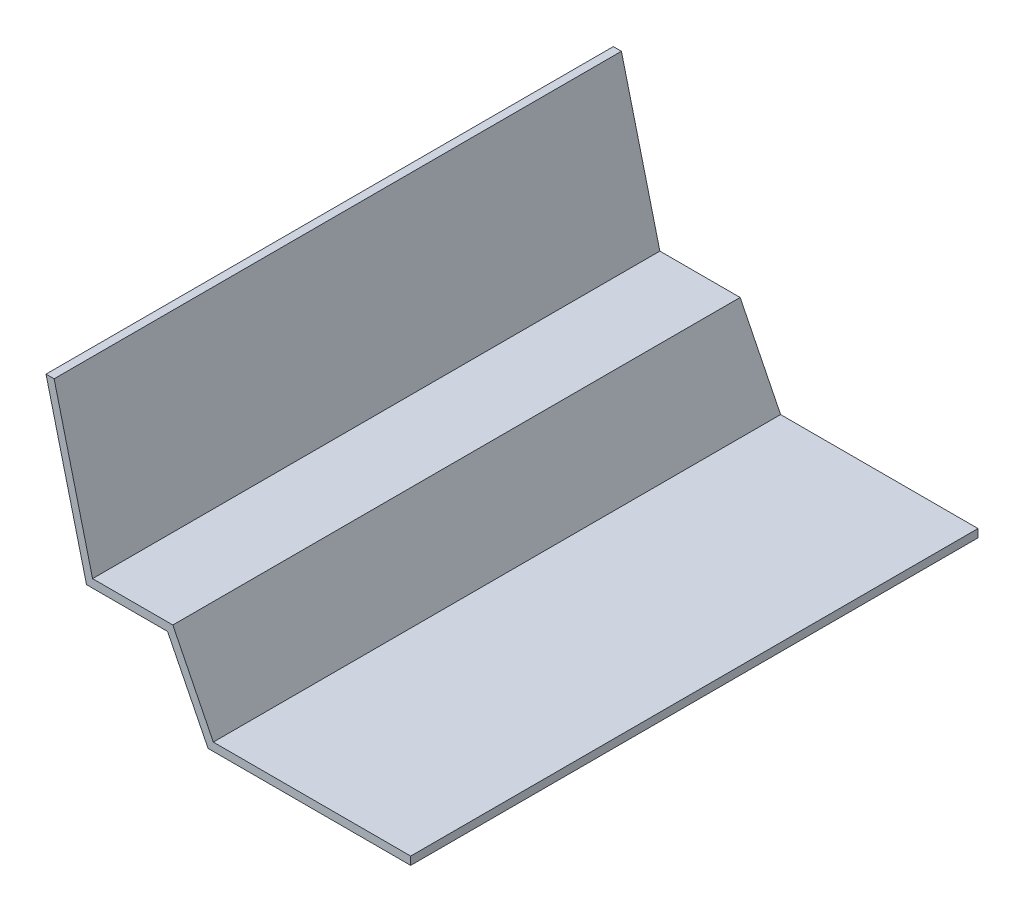
ISO-10303-21;
HEADER;
FILE_DESCRIPTION(('STEP AP214'),'2;1');
FILE_NAME('part.step','',(''),(''),'','','');
FILE_SCHEMA(('AUTOMOTIVE_DESIGN { 1 0 10303 214 1 1 1 1 }'));
ENDSEC;
DATA;
#1=APPLICATION_CONTEXT('core data for automotive mechanical design processes');
#2=APPLICATION_PROTOCOL_DEFINITION('international standard','automotive_design',2000,#1);
#3=PRODUCT_CONTEXT('',#1,'mechanical');
#4=PRODUCT('Part','Part','',(#3));
#5=PRODUCT_RELATED_PRODUCT_CATEGORY('part','',(#4));
#6=PRODUCT_DEFINITION_FORMATION('','',#4);
#7=PRODUCT_DEFINITION_CONTEXT('part definition',#1,'design');
#8=PRODUCT_DEFINITION('design','',#6,#7);
#9=PRODUCT_DEFINITION_SHAPE('','',#8);
#10=(LENGTH_UNIT() NAMED_UNIT(*) SI_UNIT(.MILLI.,.METRE.));
#11=(NAMED_UNIT(*) PLANE_ANGLE_UNIT() SI_UNIT($,.RADIAN.));
#12=(NAMED_UNIT(*) SI_UNIT($,.STERADIAN.) SOLID_ANGLE_UNIT());
#13=UNCERTAINTY_MEASURE_WITH_UNIT(LENGTH_MEASURE(1.E-05),#10,'distance_accuracy_value','');
#14=(GEOMETRIC_REPRESENTATION_CONTEXT(3) GLOBAL_UNCERTAINTY_ASSIGNED_CONTEXT((#13)) GLOBAL_UNIT_ASSIGNED_CONTEXT((#10,
#11,#12)) REPRESENTATION_CONTEXT('',''));
#15=CARTESIAN_POINT('',(0.,0.,0.));
#16=DIRECTION('',(0.,0.,1.));
#17=DIRECTION('',(1.,0.,0.));
#18=AXIS2_PLACEMENT_3D('',#15,#16,#17);
#19=CARTESIAN_POINT('',(0.,0.,140.));
#20=DIRECTION('',(-1.,0.,0.));
#21=DIRECTION('',(0.,-1.,0.));
#22=AXIS2_PLACEMENT_3D('',#19,#20,#21);
#23=PLANE('',#22);
#24=DIRECTION('',(0.,1.,0.));
#25=VECTOR('',#24,1.);
#26=CARTESIAN_POINT('',(0.,0.,0.));
#27=LINE('',#26,#25);
#28=CARTESIAN_POINT('',(0.,0.,0.));
#29=VERTEX_POINT('',#28);
#30=CARTESIAN_POINT('',(0.,2.,0.));
#31=VERTEX_POINT('',#30);
#32=EDGE_CURVE('E147',#29,#31,#27,.T.);
#33=ORIENTED_EDGE('',*,*,#32,.T.);
#34=DIRECTION('',(0.,0.,-1.));
#35=VECTOR('',#34,1.);
#36=CARTESIAN_POINT('',(0.,2.,140.));
#37=LINE('',#36,#35);
#38=CARTESIAN_POINT('',(0.,2.,140.));
#39=VERTEX_POINT('',#38);
#40=EDGE_CURVE('E11',#39,#31,#37,.T.);
#41=ORIENTED_EDGE('',*,*,#40,.F.);
#42=DIRECTION('',(0.,1.,0.));
#43=VECTOR('',#42,1.);
#44=CARTESIAN_POINT('',(0.,0.,140.));
#45=LINE('',#44,#43);
#46=CARTESIAN_POINT('',(0.,0.,140.));
#47=VERTEX_POINT('',#46);
#48=EDGE_CURVE('E165',#47,#39,#45,.T.);
#49=ORIENTED_EDGE('',*,*,#48,.F.);
#50=DIRECTION('',(0.,0.,-1.));
#51=VECTOR('',#50,1.);
#52=CARTESIAN_POINT('',(0.,0.,140.));
#53=LINE('',#52,#51);
#54=EDGE_CURVE('E143',#47,#29,#53,.T.);
#55=ORIENTED_EDGE('',*,*,#54,.T.);
#56=EDGE_LOOP('',(#33,#41,#49,#55));
#57=FACE_BOUND('',#56,.T.);
#58=ADVANCED_FACE('F39',(#57),#23,.F.);
#59=CARTESIAN_POINT('',(-48.7136017703464,2.,140.));
#60=DIRECTION('',(0.,-1.,0.));
#61=DIRECTION('',(0.,0.,-1.));
#62=AXIS2_PLACEMENT_3D('',#59,#60,#61);
#63=PLANE('',#62);
#64=DIRECTION('',(-1.,0.,0.));
#65=VECTOR('',#64,1.);
#66=CARTESIAN_POINT('',(-48.7136017703464,2.,0.));
#67=LINE('',#66,#65);
#68=CARTESIAN_POINT('',(-48.7136017703464,2.,0.));
#69=VERTEX_POINT('',#68);
#70=EDGE_CURVE('E150',#31,#69,#67,.T.);
#71=ORIENTED_EDGE('',*,*,#70,.T.);
#72=DIRECTION('',(0.,0.,-1.));
#73=VECTOR('',#72,1.);
#74=CARTESIAN_POINT('',(-48.7136017703464,2.,140.));
#75=LINE('',#74,#73);
#76=CARTESIAN_POINT('',(-48.7136017703464,2.,140.));
#77=VERTEX_POINT('',#76);
#78=EDGE_CURVE('E47',#77,#69,#75,.T.);
#79=ORIENTED_EDGE('',*,*,#78,.F.);
#80=DIRECTION('',(-1.,0.,0.));
#81=VECTOR('',#80,1.);
#82=CARTESIAN_POINT('',(-48.7136017703464,2.,140.));
#83=LINE('',#82,#81);
#84=EDGE_CURVE('E104',#39,#77,#83,.T.);
#85=ORIENTED_EDGE('',*,*,#84,.F.);
#86=ORIENTED_EDGE('',*,*,#40,.T.);
#87=EDGE_LOOP('',(#71,#79,#85,#86));
#88=FACE_BOUND('',#87,.T.);
#89=ADVANCED_FACE('F214',(#88),#63,.F.);
#90=CARTESIAN_POINT('',(-48.7136017703464,2.,140.));
#91=DIRECTION('',(-0.894940020173159,-0.446186463591699,0.));
#92=DIRECTION('',(0.446186463591699,-0.894940020173159,0.));
#93=AXIS2_PLACEMENT_3D('',#90,#91,#92);
#94=PLANE('',#93);
#95=DIRECTION('',(-0.446186463591699,0.894940020173159,0.));
#96=VECTOR('',#95,1.);
#97=CARTESIAN_POINT('',(-48.7136017703464,2.,0.));
#98=LINE('',#97,#96);
#99=CARTESIAN_POINT('',(-58.7016424211008,22.0335465794324,0.));
#100=VERTEX_POINT('',#99);
#101=EDGE_CURVE('E152',#69,#100,#98,.T.);
#102=ORIENTED_EDGE('',*,*,#101,.T.);
#103=DIRECTION('',(0.,0.,-1.));
#104=VECTOR('',#103,1.);
#105=CARTESIAN_POINT('',(-58.7016424211008,22.0335465794324,140.));
#106=LINE('',#105,#104);
#107=CARTESIAN_POINT('',(-58.7016424211008,22.0335465794324,140.));
#108=VERTEX_POINT('',#107);
#109=EDGE_CURVE('E178',#108,#100,#106,.T.);
#110=ORIENTED_EDGE('',*,*,#109,.F.);
#111=DIRECTION('',(-0.446186463591699,0.894940020173159,0.));
#112=VECTOR('',#111,1.);
#113=CARTESIAN_POINT('',(-48.7136017703464,2.,140.));
#114=LINE('',#113,#112);
#115=EDGE_CURVE('E186',#77,#108,#114,.T.);
#116=ORIENTED_EDGE('',*,*,#115,.F.);
#117=ORIENTED_EDGE('',*,*,#78,.T.);
#118=EDGE_LOOP('',(#102,#110,#116,#117));
#119=FACE_BOUND('',#118,.T.);
#120=ADVANCED_FACE('F184',(#119),#94,.F.);
#121=CARTESIAN_POINT('',(-78.5083866448581,22.0335465794324,140.));
#122=DIRECTION('',(0.,-1.,0.));
#123=DIRECTION('',(0.,0.,-1.));
#124=AXIS2_PLACEMENT_3D('',#121,#122,#123);
#125=PLANE('',#124);
#126=DIRECTION('',(-1.,0.,0.));
#127=VECTOR('',#126,1.);
#128=CARTESIAN_POINT('',(-78.5083866448581,22.0335465794324,0.));
#129=LINE('',#128,#127);
#130=CARTESIAN_POINT('',(-78.5083866448581,22.0335465794324,0.));
#131=VERTEX_POINT('',#130);
#132=EDGE_CURVE('E154',#100,#131,#129,.T.);
#133=ORIENTED_EDGE('',*,*,#132,.T.);
#134=DIRECTION('',(0.,0.,-1.));
#135=VECTOR('',#134,1.);
#136=CARTESIAN_POINT('',(-78.5083866448581,22.0335465794324,140.));
#137=LINE('',#136,#135);
#138=CARTESIAN_POINT('',(-78.5083866448581,22.0335465794324,140.));
#139=VERTEX_POINT('',#138);
#140=EDGE_CURVE('E175',#139,#131,#137,.T.);
#141=ORIENTED_EDGE('',*,*,#140,.F.);
#142=DIRECTION('',(-1.,0.,0.));
#143=VECTOR('',#142,1.);
#144=CARTESIAN_POINT('',(-78.5083866448581,22.0335465794324,140.));
#145=LINE('',#144,#143);
#146=EDGE_CURVE('E204',#108,#139,#145,.T.);
#147=ORIENTED_EDGE('',*,*,#146,.F.);
#148=ORIENTED_EDGE('',*,*,#109,.T.);
#149=EDGE_LOOP('',(#133,#141,#147,#148));
#150=FACE_BOUND('',#149,.T.);
#151=ADVANCED_FACE('F195',(#150),#125,.F.);
#152=CARTESIAN_POINT('',(-88.,60.,140.));
#153=DIRECTION('',(-0.970142500145332,-0.242535625036333,0.));
#154=DIRECTION('',(0.242535625036333,-0.970142500145332,0.));
#155=AXIS2_PLACEMENT_3D('',#152,#153,#154);
#156=PLANE('',#155);
#157=DIRECTION('',(-0.242535625036333,0.970142500145332,0.));
#158=VECTOR('',#157,1.);
#159=CARTESIAN_POINT('',(-88.,60.,0.));
#160=LINE('',#159,#158);
#161=CARTESIAN_POINT('',(-88.,60.,0.));
#162=VERTEX_POINT('',#161);
#163=EDGE_CURVE('E156',#131,#162,#160,.T.);
#164=ORIENTED_EDGE('',*,*,#163,.T.);
#165=DIRECTION('',(0.,0.,-1.));
#166=VECTOR('',#165,1.);
#167=CARTESIAN_POINT('',(-88.,60.,140.));
#168=LINE('',#167,#166);
#169=CARTESIAN_POINT('',(-88.,60.,140.));
#170=VERTEX_POINT('',#169);
#171=EDGE_CURVE('E172',#170,#162,#168,.T.);
#172=ORIENTED_EDGE('',*,*,#171,.F.);
#173=DIRECTION('',(-0.242535625036333,0.970142500145332,0.));
#174=VECTOR('',#173,1.);
#175=CARTESIAN_POINT('',(-88.,60.,140.));
#176=LINE('',#175,#174);
#177=EDGE_CURVE('E201',#139,#170,#176,.T.);
#178=ORIENTED_EDGE('',*,*,#177,.F.);
#179=ORIENTED_EDGE('',*,*,#140,.T.);
#180=EDGE_LOOP('',(#164,#172,#178,#179));
#181=FACE_BOUND('',#180,.T.);
#182=ADVANCED_FACE('F199',(#181),#156,.F.);
#183=CARTESIAN_POINT('',(-90.,60.,140.));
#184=DIRECTION('',(0.,-1.,0.));
#185=DIRECTION('',(0.,0.,-1.));
#186=AXIS2_PLACEMENT_3D('',#183,#184,#185);
#187=PLANE('',#186);
#188=DIRECTION('',(-1.,0.,0.));
#189=VECTOR('',#188,1.);
#190=CARTESIAN_POINT('',(-90.,60.,0.));
#191=LINE('',#190,#189);
#192=CARTESIAN_POINT('',(-90.,60.,0.));
#193=VERTEX_POINT('',#192);
#194=EDGE_CURVE('E158',#162,#193,#191,.T.);
#195=ORIENTED_EDGE('',*,*,#194,.T.);
#196=DIRECTION('',(0.,0.,-1.));
#197=VECTOR('',#196,1.);
#198=CARTESIAN_POINT('',(-90.,60.,140.));
#199=LINE('',#198,#197);
#200=CARTESIAN_POINT('',(-90.,60.,140.));
#201=VERTEX_POINT('',#200);
#202=EDGE_CURVE('E169',#201,#193,#199,.T.);
#203=ORIENTED_EDGE('',*,*,#202,.F.);
#204=DIRECTION('',(-1.,0.,0.));
#205=VECTOR('',#204,1.);
#206=CARTESIAN_POINT('',(-90.,60.,140.));
#207=LINE('',#206,#205);
#208=EDGE_CURVE('E203',#170,#201,#207,.T.);
#209=ORIENTED_EDGE('',*,*,#208,.F.);
#210=ORIENTED_EDGE('',*,*,#171,.T.);
#211=EDGE_LOOP('',(#195,#203,#209,#210));
#212=FACE_BOUND('',#211,.T.);
#213=ADVANCED_FACE('F226',(#212),#187,.F.);
#214=CARTESIAN_POINT('',(-80.,20.,140.));
#215=DIRECTION('',(0.970142500145332,0.242535625036333,0.));
#216=DIRECTION('',(-0.242535625036333,0.970142500145332,0.));
#217=AXIS2_PLACEMENT_3D('',#214,#215,#216);
#218=PLANE('',#217);
#219=DIRECTION('',(0.242535625036333,-0.970142500145332,0.));
#220=VECTOR('',#219,1.);
#221=CARTESIAN_POINT('',(-80.,20.,0.));
#222=LINE('',#221,#220);
#223=CARTESIAN_POINT('',(-80.,20.,0.));
#224=VERTEX_POINT('',#223);
#225=EDGE_CURVE('E160',#193,#224,#222,.T.);
#226=ORIENTED_EDGE('',*,*,#225,.T.);
#227=DIRECTION('',(0.,0.,-1.));
#228=VECTOR('',#227,1.);
#229=CARTESIAN_POINT('',(-80.,20.,140.));
#230=LINE('',#229,#228);
#231=CARTESIAN_POINT('',(-80.,20.,140.));
#232=VERTEX_POINT('',#231);
#233=EDGE_CURVE('E138',#232,#224,#230,.T.);
#234=ORIENTED_EDGE('',*,*,#233,.F.);
#235=DIRECTION('',(0.242535625036333,-0.970142500145332,0.));
#236=VECTOR('',#235,1.);
#237=CARTESIAN_POINT('',(-80.,20.,140.));
#238=LINE('',#237,#236);
#239=EDGE_CURVE('E129',#201,#232,#238,.T.);
#240=ORIENTED_EDGE('',*,*,#239,.F.);
#241=ORIENTED_EDGE('',*,*,#202,.T.);
#242=EDGE_LOOP('',(#226,#234,#240,#241));
#243=FACE_BOUND('',#242,.T.);
#244=ADVANCED_FACE('F229',(#243),#218,.F.);
#245=CARTESIAN_POINT('',(-60.,20.,140.));
#246=DIRECTION('',(0.,1.,0.));
#247=DIRECTION('',(-1.,0.,0.));
#248=AXIS2_PLACEMENT_3D('',#245,#246,#247);
#249=PLANE('',#248);
#250=DIRECTION('',(1.,0.,0.));
#251=VECTOR('',#250,1.);
#252=CARTESIAN_POINT('',(-60.,20.,0.));
#253=LINE('',#252,#251);
#254=CARTESIAN_POINT('',(-60.,20.,0.));
#255=VERTEX_POINT('',#254);
#256=EDGE_CURVE('E137',#224,#255,#253,.T.);
#257=ORIENTED_EDGE('',*,*,#256,.T.);
#258=DIRECTION('',(0.,0.,-1.));
#259=VECTOR('',#258,1.);
#260=CARTESIAN_POINT('',(-60.,20.,140.));
#261=LINE('',#260,#259);
#262=CARTESIAN_POINT('',(-60.,20.,140.));
#263=VERTEX_POINT('',#262);
#264=EDGE_CURVE('E134',#263,#255,#261,.T.);
#265=ORIENTED_EDGE('',*,*,#264,.F.);
#266=DIRECTION('',(1.,0.,0.));
#267=VECTOR('',#266,1.);
#268=CARTESIAN_POINT('',(-60.,20.,140.));
#269=LINE('',#268,#267);
#270=EDGE_CURVE('E123',#232,#263,#269,.T.);
#271=ORIENTED_EDGE('',*,*,#270,.F.);
#272=ORIENTED_EDGE('',*,*,#233,.T.);
#273=EDGE_LOOP('',(#257,#265,#271,#272));
#274=FACE_BOUND('',#273,.T.);
#275=ADVANCED_FACE('F135',(#274),#249,.F.);
#276=CARTESIAN_POINT('',(-50.,0.,140.));
#277=DIRECTION('',(0.894427190999916,0.447213595499958,0.));
#278=DIRECTION('',(-0.447213595499958,0.894427190999916,0.));
#279=AXIS2_PLACEMENT_3D('',#276,#277,#278);
#280=PLANE('',#279);
#281=DIRECTION('',(0.447213595499958,-0.894427190999916,0.));
#282=VECTOR('',#281,1.);
#283=CARTESIAN_POINT('',(-50.,0.,0.));
#284=LINE('',#283,#282);
#285=CARTESIAN_POINT('',(-50.,0.,0.));
#286=VERTEX_POINT('',#285);
#287=EDGE_CURVE('E90',#255,#286,#284,.T.);
#288=ORIENTED_EDGE('',*,*,#287,.T.);
#289=DIRECTION('',(0.,0.,-1.));
#290=VECTOR('',#289,1.);
#291=CARTESIAN_POINT('',(-50.,0.,140.));
#292=LINE('',#291,#290);
#293=CARTESIAN_POINT('',(-50.,0.,140.));
#294=VERTEX_POINT('',#293);
#295=EDGE_CURVE('E139',#294,#286,#292,.T.);
#296=ORIENTED_EDGE('',*,*,#295,.F.);
#297=DIRECTION('',(0.447213595499958,-0.894427190999916,0.));
#298=VECTOR('',#297,1.);
#299=CARTESIAN_POINT('',(-50.,0.,140.));
#300=LINE('',#299,#298);
#301=EDGE_CURVE('E127',#263,#294,#300,.T.);
#302=ORIENTED_EDGE('',*,*,#301,.F.);
#303=ORIENTED_EDGE('',*,*,#264,.T.);
#304=EDGE_LOOP('',(#288,#296,#302,#303));
#305=FACE_BOUND('',#304,.T.);
#306=ADVANCED_FACE('F141',(#305),#280,.F.);
#307=CARTESIAN_POINT('',(0.,0.,140.));
#308=DIRECTION('',(0.,1.,0.));
#309=DIRECTION('',(-1.,0.,0.));
#310=AXIS2_PLACEMENT_3D('',#307,#308,#309);
#311=PLANE('',#310);
#312=DIRECTION('',(1.,0.,0.));
#313=VECTOR('',#312,1.);
#314=CARTESIAN_POINT('',(0.,0.,0.));
#315=LINE('',#314,#313);
#316=EDGE_CURVE('E96',#286,#29,#315,.T.);
#317=ORIENTED_EDGE('',*,*,#316,.T.);
#318=ORIENTED_EDGE('',*,*,#54,.F.);
#319=DIRECTION('',(1.,0.,0.));
#320=VECTOR('',#319,1.);
#321=CARTESIAN_POINT('',(0.,0.,140.));
#322=LINE('',#321,#320);
#323=EDGE_CURVE('E55',#294,#47,#322,.T.);
#324=ORIENTED_EDGE('',*,*,#323,.F.);
#325=ORIENTED_EDGE('',*,*,#295,.T.);
#326=EDGE_LOOP('',(#317,#318,#324,#325));
#327=FACE_BOUND('',#326,.T.);
#328=ADVANCED_FACE('F238',(#327),#311,.F.);
#329=CARTESIAN_POINT('',(0.,0.,140.));
#330=DIRECTION('',(0.,0.,-1.));
#331=DIRECTION('',(-1.,0.,0.));
#332=AXIS2_PLACEMENT_3D('',#329,#330,#331);
#333=PLANE('',#332);
#334=ORIENTED_EDGE('',*,*,#48,.T.);
#335=ORIENTED_EDGE('',*,*,#84,.T.);
#336=ORIENTED_EDGE('',*,*,#115,.T.);
#337=ORIENTED_EDGE('',*,*,#146,.T.);
#338=ORIENTED_EDGE('',*,*,#177,.T.);
#339=ORIENTED_EDGE('',*,*,#208,.T.);
#340=ORIENTED_EDGE('',*,*,#239,.T.);
#341=ORIENTED_EDGE('',*,*,#270,.T.);
#342=ORIENTED_EDGE('',*,*,#301,.T.);
#343=ORIENTED_EDGE('',*,*,#323,.T.);
#344=EDGE_LOOP('',(#334,#335,#336,#337,#338,#339,#340,#341,#342,#343));
#345=FACE_BOUND('',#344,.T.);
#346=ADVANCED_FACE('F125',(#345),#333,.F.);
#347=CARTESIAN_POINT('',(0.,0.,0.));
#348=DIRECTION('',(0.,0.,-1.));
#349=DIRECTION('',(-1.,0.,0.));
#350=AXIS2_PLACEMENT_3D('',#347,#348,#349);
#351=PLANE('',#350);
#352=ORIENTED_EDGE('',*,*,#32,.F.);
#353=ORIENTED_EDGE('',*,*,#316,.F.);
#354=ORIENTED_EDGE('',*,*,#287,.F.);
#355=ORIENTED_EDGE('',*,*,#256,.F.);
#356=ORIENTED_EDGE('',*,*,#225,.F.);
#357=ORIENTED_EDGE('',*,*,#194,.F.);
#358=ORIENTED_EDGE('',*,*,#163,.F.);
#359=ORIENTED_EDGE('',*,*,#132,.F.);
#360=ORIENTED_EDGE('',*,*,#101,.F.);
#361=ORIENTED_EDGE('',*,*,#70,.F.);
#362=EDGE_LOOP('',(#352,#353,#354,#355,#356,#357,#358,#359,#360,#361));
#363=FACE_BOUND('',#362,.T.);
#364=ADVANCED_FACE('F190',(#363),#351,.T.);
#365=CLOSED_SHELL('',(#58,#89,#120,#151,#182,#213,#244,#275,#306,#328,#346,#364));
#366=MANIFOLD_SOLID_BREP('B2',#365);
#367=ADVANCED_BREP_SHAPE_REPRESENTATION('',(#18,#366),#14);
#368=SHAPE_DEFINITION_REPRESENTATION(#9,#367);
ENDSEC;
END-ISO-10303-21;
